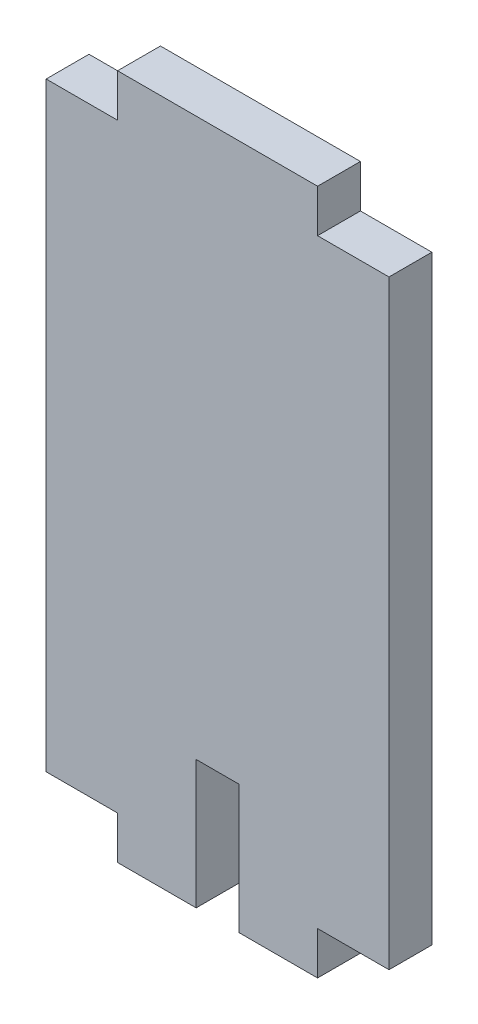
ISO-10303-21;
HEADER;
FILE_DESCRIPTION(('STEP AP214'),'2;1');
FILE_NAME('part.step','',(''),(''),'','','');
FILE_SCHEMA(('AUTOMOTIVE_DESIGN { 1 0 10303 214 1 1 1 1 }'));
ENDSEC;
DATA;
#1=APPLICATION_CONTEXT('core data for automotive mechanical design processes');
#2=APPLICATION_PROTOCOL_DEFINITION('international standard','automotive_design',2000,#1);
#3=PRODUCT_CONTEXT('',#1,'mechanical');
#4=PRODUCT('Part','Part','',(#3));
#5=PRODUCT_RELATED_PRODUCT_CATEGORY('part','',(#4));
#6=PRODUCT_DEFINITION_FORMATION('','',#4);
#7=PRODUCT_DEFINITION_CONTEXT('part definition',#1,'design');
#8=PRODUCT_DEFINITION('design','',#6,#7);
#9=PRODUCT_DEFINITION_SHAPE('','',#8);
#10=(LENGTH_UNIT() NAMED_UNIT(*) SI_UNIT(.MILLI.,.METRE.));
#11=(NAMED_UNIT(*) PLANE_ANGLE_UNIT() SI_UNIT($,.RADIAN.));
#12=(NAMED_UNIT(*) SI_UNIT($,.STERADIAN.) SOLID_ANGLE_UNIT());
#13=UNCERTAINTY_MEASURE_WITH_UNIT(LENGTH_MEASURE(1.E-05),#10,'distance_accuracy_value','');
#14=(GEOMETRIC_REPRESENTATION_CONTEXT(3) GLOBAL_UNCERTAINTY_ASSIGNED_CONTEXT((#13)) GLOBAL_UNIT_ASSIGNED_CONTEXT((#10,
#11,#12)) REPRESENTATION_CONTEXT('',''));
#15=CARTESIAN_POINT('',(0.,0.,0.));
#16=DIRECTION('',(0.,0.,1.));
#17=DIRECTION('',(1.,0.,0.));
#18=AXIS2_PLACEMENT_3D('',#15,#16,#17);
#19=CARTESIAN_POINT('',(0.,0.,6.35));
#20=DIRECTION('',(0.,1.,0.));
#21=DIRECTION('',(0.,0.,1.));
#22=AXIS2_PLACEMENT_3D('',#19,#20,#21);
#23=PLANE('',#22);
#24=DIRECTION('',(1.,0.,0.));
#25=VECTOR('',#24,1.);
#26=CARTESIAN_POINT('',(0.,0.,6.35));
#27=LINE('',#26,#25);
#28=CARTESIAN_POINT('',(10.5833333333333,0.,6.35));
#29=VERTEX_POINT('',#28);
#30=CARTESIAN_POINT('',(22.225,0.,6.35));
#31=VERTEX_POINT('',#30);
#32=EDGE_CURVE('E227',#29,#31,#27,.T.);
#33=ORIENTED_EDGE('',*,*,#32,.F.);
#34=DIRECTION('',(0.,0.,1.));
#35=VECTOR('',#34,1.);
#36=CARTESIAN_POINT('',(10.5833333333333,0.,0.));
#37=LINE('',#36,#35);
#38=CARTESIAN_POINT('',(10.5833333333333,0.,0.));
#39=VERTEX_POINT('',#38);
#40=EDGE_CURVE('E195',#39,#29,#37,.T.);
#41=ORIENTED_EDGE('',*,*,#40,.F.);
#42=DIRECTION('',(1.,0.,0.));
#43=VECTOR('',#42,1.);
#44=CARTESIAN_POINT('',(0.,0.,0.));
#45=LINE('',#44,#43);
#46=CARTESIAN_POINT('',(22.225,0.,0.));
#47=VERTEX_POINT('',#46);
#48=EDGE_CURVE('E175',#39,#47,#45,.T.);
#49=ORIENTED_EDGE('',*,*,#48,.T.);
#50=DIRECTION('',(0.,0.,1.));
#51=VECTOR('',#50,1.);
#52=CARTESIAN_POINT('',(22.225,0.,0.));
#53=LINE('',#52,#51);
#54=EDGE_CURVE('E193',#47,#31,#53,.T.);
#55=ORIENTED_EDGE('',*,*,#54,.T.);
#56=EDGE_LOOP('',(#33,#41,#49,#55));
#57=FACE_BOUND('',#56,.T.);
#58=ADVANCED_FACE('F33',(#57),#23,.F.);
#59=CARTESIAN_POINT('',(0.,0.,6.35));
#60=DIRECTION('',(1.,0.,0.));
#61=DIRECTION('',(0.,0.,-1.));
#62=AXIS2_PLACEMENT_3D('',#59,#60,#61);
#63=PLANE('',#62);
#64=DIRECTION('',(0.,-1.,0.));
#65=VECTOR('',#64,1.);
#66=CARTESIAN_POINT('',(0.,0.,0.));
#67=LINE('',#66,#65);
#68=CARTESIAN_POINT('',(0.,95.25,0.));
#69=VERTEX_POINT('',#68);
#70=CARTESIAN_POINT('',(0.,6.34999999999999,0.));
#71=VERTEX_POINT('',#70);
#72=EDGE_CURVE('E165',#69,#71,#67,.T.);
#73=ORIENTED_EDGE('',*,*,#72,.T.);
#74=DIRECTION('',(0.,0.,1.));
#75=VECTOR('',#74,1.);
#76=CARTESIAN_POINT('',(0.,6.34999999999999,0.));
#77=LINE('',#76,#75);
#78=CARTESIAN_POINT('',(0.,6.34999999999999,6.35));
#79=VERTEX_POINT('',#78);
#80=EDGE_CURVE('E247',#71,#79,#77,.T.);
#81=ORIENTED_EDGE('',*,*,#80,.T.);
#82=DIRECTION('',(0.,-1.,0.));
#83=VECTOR('',#82,1.);
#84=CARTESIAN_POINT('',(0.,0.,6.35));
#85=LINE('',#84,#83);
#86=CARTESIAN_POINT('',(0.,95.25,6.35));
#87=VERTEX_POINT('',#86);
#88=EDGE_CURVE('E167',#87,#79,#85,.T.);
#89=ORIENTED_EDGE('',*,*,#88,.F.);
#90=DIRECTION('',(0.,0.,1.));
#91=VECTOR('',#90,1.);
#92=CARTESIAN_POINT('',(0.,95.25,0.));
#93=LINE('',#92,#91);
#94=EDGE_CURVE('E152',#69,#87,#93,.T.);
#95=ORIENTED_EDGE('',*,*,#94,.F.);
#96=EDGE_LOOP('',(#73,#81,#89,#95));
#97=FACE_BOUND('',#96,.T.);
#98=ADVANCED_FACE('F35',(#97),#63,.F.);
#99=CARTESIAN_POINT('',(28.575,0.,0.));
#100=VERTEX_POINT('',#99);
#101=CARTESIAN_POINT('',(40.2166666666667,0.,0.));
#102=VERTEX_POINT('',#101);
#103=EDGE_CURVE('E171',#100,#102,#45,.T.);
#104=ORIENTED_EDGE('',*,*,#103,.T.);
#105=DIRECTION('',(0.,0.,1.));
#106=VECTOR('',#105,1.);
#107=CARTESIAN_POINT('',(40.2166666666667,0.,0.));
#108=LINE('',#107,#106);
#109=CARTESIAN_POINT('',(40.2166666666667,0.,6.35));
#110=VERTEX_POINT('',#109);
#111=EDGE_CURVE('E255',#102,#110,#108,.T.);
#112=ORIENTED_EDGE('',*,*,#111,.T.);
#113=CARTESIAN_POINT('',(28.575,0.,6.35));
#114=VERTEX_POINT('',#113);
#115=EDGE_CURVE('E225',#114,#110,#27,.T.);
#116=ORIENTED_EDGE('',*,*,#115,.F.);
#117=DIRECTION('',(0.,0.,1.));
#118=VECTOR('',#117,1.);
#119=CARTESIAN_POINT('',(28.575,0.,0.));
#120=LINE('',#119,#118);
#121=EDGE_CURVE('E221',#100,#114,#120,.T.);
#122=ORIENTED_EDGE('',*,*,#121,.F.);
#123=EDGE_LOOP('',(#104,#112,#116,#122));
#124=FACE_BOUND('',#123,.T.);
#125=ADVANCED_FACE('F310',(#124),#23,.F.);
#126=CARTESIAN_POINT('',(50.8,0.,6.35));
#127=DIRECTION('',(-1.,0.,0.));
#128=DIRECTION('',(0.,0.,1.));
#129=AXIS2_PLACEMENT_3D('',#126,#127,#128);
#130=PLANE('',#129);
#131=DIRECTION('',(0.,1.,0.));
#132=VECTOR('',#131,1.);
#133=CARTESIAN_POINT('',(50.8,0.,6.35));
#134=LINE('',#133,#132);
#135=CARTESIAN_POINT('',(50.8,6.34999999999999,6.35));
#136=VERTEX_POINT('',#135);
#137=CARTESIAN_POINT('',(50.8,95.25,6.35));
#138=VERTEX_POINT('',#137);
#139=EDGE_CURVE('E42',#136,#138,#134,.T.);
#140=ORIENTED_EDGE('',*,*,#139,.F.);
#141=DIRECTION('',(0.,0.,1.));
#142=VECTOR('',#141,1.);
#143=CARTESIAN_POINT('',(50.8,6.34999999999999,0.));
#144=LINE('',#143,#142);
#145=CARTESIAN_POINT('',(50.8,6.34999999999999,0.));
#146=VERTEX_POINT('',#145);
#147=EDGE_CURVE('E251',#146,#136,#144,.T.);
#148=ORIENTED_EDGE('',*,*,#147,.F.);
#149=DIRECTION('',(0.,1.,0.));
#150=VECTOR('',#149,1.);
#151=CARTESIAN_POINT('',(50.8,0.,0.));
#152=LINE('',#151,#150);
#153=CARTESIAN_POINT('',(50.8,95.25,0.));
#154=VERTEX_POINT('',#153);
#155=EDGE_CURVE('E180',#146,#154,#152,.T.);
#156=ORIENTED_EDGE('',*,*,#155,.T.);
#157=DIRECTION('',(0.,0.,1.));
#158=VECTOR('',#157,1.);
#159=CARTESIAN_POINT('',(50.8,95.25,0.));
#160=LINE('',#159,#158);
#161=EDGE_CURVE('E272',#154,#138,#160,.T.);
#162=ORIENTED_EDGE('',*,*,#161,.T.);
#163=EDGE_LOOP('',(#140,#148,#156,#162));
#164=FACE_BOUND('',#163,.T.);
#165=ADVANCED_FACE('F302',(#164),#130,.F.);
#166=CARTESIAN_POINT('',(0.,101.6,6.35));
#167=DIRECTION('',(0.,-1.,0.));
#168=DIRECTION('',(0.,0.,-1.));
#169=AXIS2_PLACEMENT_3D('',#166,#167,#168);
#170=PLANE('',#169);
#171=DIRECTION('',(-1.,0.,0.));
#172=VECTOR('',#171,1.);
#173=CARTESIAN_POINT('',(0.,101.6,6.35));
#174=LINE('',#173,#172);
#175=CARTESIAN_POINT('',(40.2166666666667,101.6,6.35));
#176=VERTEX_POINT('',#175);
#177=CARTESIAN_POINT('',(10.5833333333333,101.6,6.35));
#178=VERTEX_POINT('',#177);
#179=EDGE_CURVE('E11',#176,#178,#174,.T.);
#180=ORIENTED_EDGE('',*,*,#179,.F.);
#181=DIRECTION('',(0.,0.,1.));
#182=VECTOR('',#181,1.);
#183=CARTESIAN_POINT('',(40.2166666666667,101.6,0.));
#184=LINE('',#183,#182);
#185=CARTESIAN_POINT('',(40.2166666666667,101.6,0.));
#186=VERTEX_POINT('',#185);
#187=EDGE_CURVE('E267',#186,#176,#184,.T.);
#188=ORIENTED_EDGE('',*,*,#187,.F.);
#189=DIRECTION('',(-1.,0.,0.));
#190=VECTOR('',#189,1.);
#191=CARTESIAN_POINT('',(0.,101.6,0.));
#192=LINE('',#191,#190);
#193=CARTESIAN_POINT('',(10.5833333333333,101.6,0.));
#194=VERTEX_POINT('',#193);
#195=EDGE_CURVE('E37',#186,#194,#192,.T.);
#196=ORIENTED_EDGE('',*,*,#195,.T.);
#197=DIRECTION('',(0.,0.,1.));
#198=VECTOR('',#197,1.);
#199=CARTESIAN_POINT('',(10.5833333333333,101.6,0.));
#200=LINE('',#199,#198);
#201=EDGE_CURVE('E217',#194,#178,#200,.T.);
#202=ORIENTED_EDGE('',*,*,#201,.T.);
#203=EDGE_LOOP('',(#180,#188,#196,#202));
#204=FACE_BOUND('',#203,.T.);
#205=ADVANCED_FACE('F294',(#204),#170,.F.);
#206=CARTESIAN_POINT('',(0.,0.,6.35));
#207=DIRECTION('',(0.,0.,-1.));
#208=DIRECTION('',(-1.,0.,0.));
#209=AXIS2_PLACEMENT_3D('',#206,#207,#208);
#210=PLANE('',#209);
#211=ORIENTED_EDGE('',*,*,#88,.T.);
#212=DIRECTION('',(-1.,0.,0.));
#213=VECTOR('',#212,1.);
#214=CARTESIAN_POINT('',(0.,6.34999999999999,6.35));
#215=LINE('',#214,#213);
#216=CARTESIAN_POINT('',(10.5833333333333,6.34999999999999,6.35));
#217=VERTEX_POINT('',#216);
#218=EDGE_CURVE('E240',#217,#79,#215,.T.);
#219=ORIENTED_EDGE('',*,*,#218,.F.);
#220=DIRECTION('',(0.,1.,0.));
#221=VECTOR('',#220,1.);
#222=CARTESIAN_POINT('',(10.5833333333333,0.,6.35));
#223=LINE('',#222,#221);
#224=EDGE_CURVE('E239',#29,#217,#223,.T.);
#225=ORIENTED_EDGE('',*,*,#224,.F.);
#226=ORIENTED_EDGE('',*,*,#32,.T.);
#227=DIRECTION('',(0.,-1.,0.));
#228=VECTOR('',#227,1.);
#229=CARTESIAN_POINT('',(22.225,0.,6.35));
#230=LINE('',#229,#228);
#231=CARTESIAN_POINT('',(22.225,19.05,6.35));
#232=VERTEX_POINT('',#231);
#233=EDGE_CURVE('E215',#232,#31,#230,.T.);
#234=ORIENTED_EDGE('',*,*,#233,.F.);
#235=DIRECTION('',(-1.,0.,0.));
#236=VECTOR('',#235,1.);
#237=CARTESIAN_POINT('',(22.225,19.05,6.35));
#238=LINE('',#237,#236);
#239=CARTESIAN_POINT('',(28.575,19.05,6.35));
#240=VERTEX_POINT('',#239);
#241=EDGE_CURVE('E205',#240,#232,#238,.T.);
#242=ORIENTED_EDGE('',*,*,#241,.F.);
#243=DIRECTION('',(0.,1.,0.));
#244=VECTOR('',#243,1.);
#245=CARTESIAN_POINT('',(28.575,0.,6.35));
#246=LINE('',#245,#244);
#247=EDGE_CURVE('E209',#114,#240,#246,.T.);
#248=ORIENTED_EDGE('',*,*,#247,.F.);
#249=ORIENTED_EDGE('',*,*,#115,.T.);
#250=DIRECTION('',(0.,-1.,0.));
#251=VECTOR('',#250,1.);
#252=CARTESIAN_POINT('',(40.2166666666667,0.,6.35));
#253=LINE('',#252,#251);
#254=CARTESIAN_POINT('',(40.2166666666667,6.34999999999999,6.35));
#255=VERTEX_POINT('',#254);
#256=EDGE_CURVE('E259',#255,#110,#253,.T.);
#257=ORIENTED_EDGE('',*,*,#256,.F.);
#258=DIRECTION('',(-1.,0.,0.));
#259=VECTOR('',#258,1.);
#260=CARTESIAN_POINT('',(50.8,6.34999999999999,6.35));
#261=LINE('',#260,#259);
#262=EDGE_CURVE('E248',#136,#255,#261,.T.);
#263=ORIENTED_EDGE('',*,*,#262,.F.);
#264=ORIENTED_EDGE('',*,*,#139,.T.);
#265=DIRECTION('',(1.,0.,0.));
#266=VECTOR('',#265,1.);
#267=CARTESIAN_POINT('',(50.8,95.25,6.35));
#268=LINE('',#267,#266);
#269=CARTESIAN_POINT('',(40.2166666666667,95.25,6.35));
#270=VERTEX_POINT('',#269);
#271=EDGE_CURVE('E275',#270,#138,#268,.T.);
#272=ORIENTED_EDGE('',*,*,#271,.F.);
#273=DIRECTION('',(0.,-1.,0.));
#274=VECTOR('',#273,1.);
#275=CARTESIAN_POINT('',(40.2166666666667,101.6,6.35));
#276=LINE('',#275,#274);
#277=EDGE_CURVE('E258',#176,#270,#276,.T.);
#278=ORIENTED_EDGE('',*,*,#277,.F.);
#279=ORIENTED_EDGE('',*,*,#179,.T.);
#280=DIRECTION('',(0.,1.,0.));
#281=VECTOR('',#280,1.);
#282=CARTESIAN_POINT('',(10.5833333333333,101.6,6.35));
#283=LINE('',#282,#281);
#284=CARTESIAN_POINT('',(10.5833333333333,95.25,6.35));
#285=VERTEX_POINT('',#284);
#286=EDGE_CURVE('E159',#285,#178,#283,.T.);
#287=ORIENTED_EDGE('',*,*,#286,.F.);
#288=DIRECTION('',(1.,0.,0.));
#289=VECTOR('',#288,1.);
#290=CARTESIAN_POINT('',(0.,95.25,6.35));
#291=LINE('',#290,#289);
#292=EDGE_CURVE('E274',#87,#285,#291,.T.);
#293=ORIENTED_EDGE('',*,*,#292,.F.);
#294=EDGE_LOOP('',(#211,#219,#225,#226,#234,#242,#248,#249,#257,#263,#264,#272,#278,#279,#287,#293));
#295=FACE_BOUND('',#294,.T.);
#296=ADVANCED_FACE('F235',(#295),#210,.F.);
#297=CARTESIAN_POINT('',(0.,0.,0.));
#298=DIRECTION('',(0.,0.,-1.));
#299=DIRECTION('',(-1.,0.,0.));
#300=AXIS2_PLACEMENT_3D('',#297,#298,#299);
#301=PLANE('',#300);
#302=DIRECTION('',(-1.,0.,0.));
#303=VECTOR('',#302,1.);
#304=CARTESIAN_POINT('',(0.,6.34999999999999,0.));
#305=LINE('',#304,#303);
#306=CARTESIAN_POINT('',(10.5833333333333,6.34999999999999,0.));
#307=VERTEX_POINT('',#306);
#308=EDGE_CURVE('E50',#307,#71,#305,.T.);
#309=ORIENTED_EDGE('',*,*,#308,.T.);
#310=ORIENTED_EDGE('',*,*,#72,.F.);
#311=DIRECTION('',(1.,0.,0.));
#312=VECTOR('',#311,1.);
#313=CARTESIAN_POINT('',(0.,95.25,0.));
#314=LINE('',#313,#312);
#315=CARTESIAN_POINT('',(10.5833333333333,95.25,0.));
#316=VERTEX_POINT('',#315);
#317=EDGE_CURVE('E148',#69,#316,#314,.T.);
#318=ORIENTED_EDGE('',*,*,#317,.T.);
#319=DIRECTION('',(0.,1.,0.));
#320=VECTOR('',#319,1.);
#321=CARTESIAN_POINT('',(10.5833333333333,101.6,0.));
#322=LINE('',#321,#320);
#323=EDGE_CURVE('E158',#316,#194,#322,.T.);
#324=ORIENTED_EDGE('',*,*,#323,.T.);
#325=ORIENTED_EDGE('',*,*,#195,.F.);
#326=DIRECTION('',(0.,-1.,0.));
#327=VECTOR('',#326,1.);
#328=CARTESIAN_POINT('',(40.2166666666667,101.6,0.));
#329=LINE('',#328,#327);
#330=CARTESIAN_POINT('',(40.2166666666667,95.25,0.));
#331=VERTEX_POINT('',#330);
#332=EDGE_CURVE('E277',#186,#331,#329,.T.);
#333=ORIENTED_EDGE('',*,*,#332,.T.);
#334=DIRECTION('',(1.,0.,0.));
#335=VECTOR('',#334,1.);
#336=CARTESIAN_POINT('',(50.8,95.25,0.));
#337=LINE('',#336,#335);
#338=EDGE_CURVE('E270',#331,#154,#337,.T.);
#339=ORIENTED_EDGE('',*,*,#338,.T.);
#340=ORIENTED_EDGE('',*,*,#155,.F.);
#341=DIRECTION('',(-1.,0.,0.));
#342=VECTOR('',#341,1.);
#343=CARTESIAN_POINT('',(50.8,6.34999999999999,0.));
#344=LINE('',#343,#342);
#345=CARTESIAN_POINT('',(40.2166666666667,6.34999999999999,0.));
#346=VERTEX_POINT('',#345);
#347=EDGE_CURVE('E261',#146,#346,#344,.T.);
#348=ORIENTED_EDGE('',*,*,#347,.T.);
#349=DIRECTION('',(0.,-1.,0.));
#350=VECTOR('',#349,1.);
#351=CARTESIAN_POINT('',(40.2166666666667,0.,0.));
#352=LINE('',#351,#350);
#353=EDGE_CURVE('E58',#346,#102,#352,.T.);
#354=ORIENTED_EDGE('',*,*,#353,.T.);
#355=ORIENTED_EDGE('',*,*,#103,.F.);
#356=DIRECTION('',(0.,1.,0.));
#357=VECTOR('',#356,1.);
#358=CARTESIAN_POINT('',(28.575,0.,0.));
#359=LINE('',#358,#357);
#360=CARTESIAN_POINT('',(28.575,19.05,0.));
#361=VERTEX_POINT('',#360);
#362=EDGE_CURVE('E204',#100,#361,#359,.T.);
#363=ORIENTED_EDGE('',*,*,#362,.T.);
#364=DIRECTION('',(-1.,0.,0.));
#365=VECTOR('',#364,1.);
#366=CARTESIAN_POINT('',(22.225,19.05,0.));
#367=LINE('',#366,#365);
#368=CARTESIAN_POINT('',(22.225,19.05,0.));
#369=VERTEX_POINT('',#368);
#370=EDGE_CURVE('E202',#361,#369,#367,.T.);
#371=ORIENTED_EDGE('',*,*,#370,.T.);
#372=DIRECTION('',(0.,-1.,0.));
#373=VECTOR('',#372,1.);
#374=CARTESIAN_POINT('',(22.225,0.,0.));
#375=LINE('',#374,#373);
#376=EDGE_CURVE('E200',#369,#47,#375,.T.);
#377=ORIENTED_EDGE('',*,*,#376,.T.);
#378=ORIENTED_EDGE('',*,*,#48,.F.);
#379=DIRECTION('',(0.,1.,0.));
#380=VECTOR('',#379,1.);
#381=CARTESIAN_POINT('',(10.5833333333333,0.,0.));
#382=LINE('',#381,#380);
#383=EDGE_CURVE('E197',#39,#307,#382,.T.);
#384=ORIENTED_EDGE('',*,*,#383,.T.);
#385=EDGE_LOOP('',(#309,#310,#318,#324,#325,#333,#339,#340,#348,#354,#355,#363,#371,#377,#378,#384));
#386=FACE_BOUND('',#385,.T.);
#387=ADVANCED_FACE('F169',(#386),#301,.T.);
#388=CARTESIAN_POINT('',(22.225,0.,0.));
#389=DIRECTION('',(-1.,0.,0.));
#390=DIRECTION('',(0.,-1.,0.));
#391=AXIS2_PLACEMENT_3D('',#388,#389,#390);
#392=PLANE('',#391);
#393=ORIENTED_EDGE('',*,*,#233,.T.);
#394=ORIENTED_EDGE('',*,*,#54,.F.);
#395=ORIENTED_EDGE('',*,*,#376,.F.);
#396=DIRECTION('',(0.,0.,1.));
#397=VECTOR('',#396,1.);
#398=CARTESIAN_POINT('',(22.225,19.05,0.));
#399=LINE('',#398,#397);
#400=EDGE_CURVE('E172',#369,#232,#399,.T.);
#401=ORIENTED_EDGE('',*,*,#400,.T.);
#402=EDGE_LOOP('',(#393,#394,#395,#401));
#403=FACE_BOUND('',#402,.T.);
#404=ADVANCED_FACE('F318',(#403),#392,.F.);
#405=CARTESIAN_POINT('',(22.225,19.05,0.));
#406=DIRECTION('',(0.,1.,0.));
#407=DIRECTION('',(0.,0.,1.));
#408=AXIS2_PLACEMENT_3D('',#405,#406,#407);
#409=PLANE('',#408);
#410=ORIENTED_EDGE('',*,*,#241,.T.);
#411=ORIENTED_EDGE('',*,*,#400,.F.);
#412=ORIENTED_EDGE('',*,*,#370,.F.);
#413=DIRECTION('',(0.,0.,1.));
#414=VECTOR('',#413,1.);
#415=CARTESIAN_POINT('',(28.575,19.05,0.));
#416=LINE('',#415,#414);
#417=EDGE_CURVE('E177',#361,#240,#416,.T.);
#418=ORIENTED_EDGE('',*,*,#417,.T.);
#419=EDGE_LOOP('',(#410,#411,#412,#418));
#420=FACE_BOUND('',#419,.T.);
#421=ADVANCED_FACE('F317',(#420),#409,.F.);
#422=CARTESIAN_POINT('',(28.575,0.,0.));
#423=DIRECTION('',(1.,0.,0.));
#424=DIRECTION('',(0.,0.,-1.));
#425=AXIS2_PLACEMENT_3D('',#422,#423,#424);
#426=PLANE('',#425);
#427=ORIENTED_EDGE('',*,*,#247,.T.);
#428=ORIENTED_EDGE('',*,*,#417,.F.);
#429=ORIENTED_EDGE('',*,*,#362,.F.);
#430=ORIENTED_EDGE('',*,*,#121,.T.);
#431=EDGE_LOOP('',(#427,#428,#429,#430));
#432=FACE_BOUND('',#431,.T.);
#433=ADVANCED_FACE('F315',(#432),#426,.F.);
#434=CARTESIAN_POINT('',(10.5833333333333,101.6,0.));
#435=DIRECTION('',(1.,0.,0.));
#436=DIRECTION('',(0.,0.,-1.));
#437=AXIS2_PLACEMENT_3D('',#434,#435,#436);
#438=PLANE('',#437);
#439=ORIENTED_EDGE('',*,*,#286,.T.);
#440=ORIENTED_EDGE('',*,*,#201,.F.);
#441=ORIENTED_EDGE('',*,*,#323,.F.);
#442=DIRECTION('',(0.,0.,1.));
#443=VECTOR('',#442,1.);
#444=CARTESIAN_POINT('',(10.5833333333333,95.25,0.));
#445=LINE('',#444,#443);
#446=EDGE_CURVE('E154',#316,#285,#445,.T.);
#447=ORIENTED_EDGE('',*,*,#446,.T.);
#448=EDGE_LOOP('',(#439,#440,#441,#447));
#449=FACE_BOUND('',#448,.T.);
#450=ADVANCED_FACE('F371',(#449),#438,.F.);
#451=CARTESIAN_POINT('',(0.,95.25,0.));
#452=DIRECTION('',(0.,-1.,0.));
#453=DIRECTION('',(0.,0.,-1.));
#454=AXIS2_PLACEMENT_3D('',#451,#452,#453);
#455=PLANE('',#454);
#456=ORIENTED_EDGE('',*,*,#292,.T.);
#457=ORIENTED_EDGE('',*,*,#446,.F.);
#458=ORIENTED_EDGE('',*,*,#317,.F.);
#459=ORIENTED_EDGE('',*,*,#94,.T.);
#460=EDGE_LOOP('',(#456,#457,#458,#459));
#461=FACE_BOUND('',#460,.T.);
#462=ADVANCED_FACE('F151',(#461),#455,.F.);
#463=CARTESIAN_POINT('',(50.8,95.25,0.));
#464=DIRECTION('',(0.,-1.,0.));
#465=DIRECTION('',(0.,0.,-1.));
#466=AXIS2_PLACEMENT_3D('',#463,#464,#465);
#467=PLANE('',#466);
#468=ORIENTED_EDGE('',*,*,#271,.T.);
#469=ORIENTED_EDGE('',*,*,#161,.F.);
#470=ORIENTED_EDGE('',*,*,#338,.F.);
#471=DIRECTION('',(0.,0.,1.));
#472=VECTOR('',#471,1.);
#473=CARTESIAN_POINT('',(40.2166666666667,95.25,0.));
#474=LINE('',#473,#472);
#475=EDGE_CURVE('E269',#331,#270,#474,.T.);
#476=ORIENTED_EDGE('',*,*,#475,.T.);
#477=EDGE_LOOP('',(#468,#469,#470,#476));
#478=FACE_BOUND('',#477,.T.);
#479=ADVANCED_FACE('F301',(#478),#467,.F.);
#480=CARTESIAN_POINT('',(40.2166666666667,101.6,0.));
#481=DIRECTION('',(-1.,0.,0.));
#482=DIRECTION('',(0.,0.,1.));
#483=AXIS2_PLACEMENT_3D('',#480,#481,#482);
#484=PLANE('',#483);
#485=ORIENTED_EDGE('',*,*,#277,.T.);
#486=ORIENTED_EDGE('',*,*,#475,.F.);
#487=ORIENTED_EDGE('',*,*,#332,.F.);
#488=ORIENTED_EDGE('',*,*,#187,.T.);
#489=EDGE_LOOP('',(#485,#486,#487,#488));
#490=FACE_BOUND('',#489,.T.);
#491=ADVANCED_FACE('F297',(#490),#484,.F.);
#492=CARTESIAN_POINT('',(40.2166666666667,0.,0.));
#493=DIRECTION('',(-1.,0.,0.));
#494=DIRECTION('',(0.,0.,1.));
#495=AXIS2_PLACEMENT_3D('',#492,#493,#494);
#496=PLANE('',#495);
#497=ORIENTED_EDGE('',*,*,#256,.T.);
#498=ORIENTED_EDGE('',*,*,#111,.F.);
#499=ORIENTED_EDGE('',*,*,#353,.F.);
#500=DIRECTION('',(0.,0.,1.));
#501=VECTOR('',#500,1.);
#502=CARTESIAN_POINT('',(40.2166666666667,6.34999999999999,0.));
#503=LINE('',#502,#501);
#504=EDGE_CURVE('E253',#346,#255,#503,.T.);
#505=ORIENTED_EDGE('',*,*,#504,.T.);
#506=EDGE_LOOP('',(#497,#498,#499,#505));
#507=FACE_BOUND('',#506,.T.);
#508=ADVANCED_FACE('F307',(#507),#496,.F.);
#509=CARTESIAN_POINT('',(50.8,6.34999999999999,0.));
#510=DIRECTION('',(0.,1.,0.));
#511=DIRECTION('',(0.,0.,1.));
#512=AXIS2_PLACEMENT_3D('',#509,#510,#511);
#513=PLANE('',#512);
#514=ORIENTED_EDGE('',*,*,#262,.T.);
#515=ORIENTED_EDGE('',*,*,#504,.F.);
#516=ORIENTED_EDGE('',*,*,#347,.F.);
#517=ORIENTED_EDGE('',*,*,#147,.T.);
#518=EDGE_LOOP('',(#514,#515,#516,#517));
#519=FACE_BOUND('',#518,.T.);
#520=ADVANCED_FACE('F305',(#519),#513,.F.);
#521=CARTESIAN_POINT('',(0.,6.34999999999999,0.));
#522=DIRECTION('',(0.,1.,0.));
#523=DIRECTION('',(0.,0.,1.));
#524=AXIS2_PLACEMENT_3D('',#521,#522,#523);
#525=PLANE('',#524);
#526=ORIENTED_EDGE('',*,*,#218,.T.);
#527=ORIENTED_EDGE('',*,*,#80,.F.);
#528=ORIENTED_EDGE('',*,*,#308,.F.);
#529=DIRECTION('',(0.,0.,1.));
#530=VECTOR('',#529,1.);
#531=CARTESIAN_POINT('',(10.5833333333333,6.34999999999999,0.));
#532=LINE('',#531,#530);
#533=EDGE_CURVE('E249',#307,#217,#532,.T.);
#534=ORIENTED_EDGE('',*,*,#533,.T.);
#535=EDGE_LOOP('',(#526,#527,#528,#534));
#536=FACE_BOUND('',#535,.T.);
#537=ADVANCED_FACE('F419',(#536),#525,.F.);
#538=CARTESIAN_POINT('',(10.5833333333333,0.,0.));
#539=DIRECTION('',(1.,0.,0.));
#540=DIRECTION('',(0.,0.,-1.));
#541=AXIS2_PLACEMENT_3D('',#538,#539,#540);
#542=PLANE('',#541);
#543=ORIENTED_EDGE('',*,*,#224,.T.);
#544=ORIENTED_EDGE('',*,*,#533,.F.);
#545=ORIENTED_EDGE('',*,*,#383,.F.);
#546=ORIENTED_EDGE('',*,*,#40,.T.);
#547=EDGE_LOOP('',(#543,#544,#545,#546));
#548=FACE_BOUND('',#547,.T.);
#549=ADVANCED_FACE('F428',(#548),#542,.F.);
#550=CLOSED_SHELL('',(#58,#98,#125,#165,#205,#296,#387,#404,#421,#433,#450,#462,#479,#491,#508,
#520,#537,#549));
#551=MANIFOLD_SOLID_BREP('B2',#550);
#552=ADVANCED_BREP_SHAPE_REPRESENTATION('',(#18,#551),#14);
#553=SHAPE_DEFINITION_REPRESENTATION(#9,#552);
ENDSEC;
END-ISO-10303-21;
